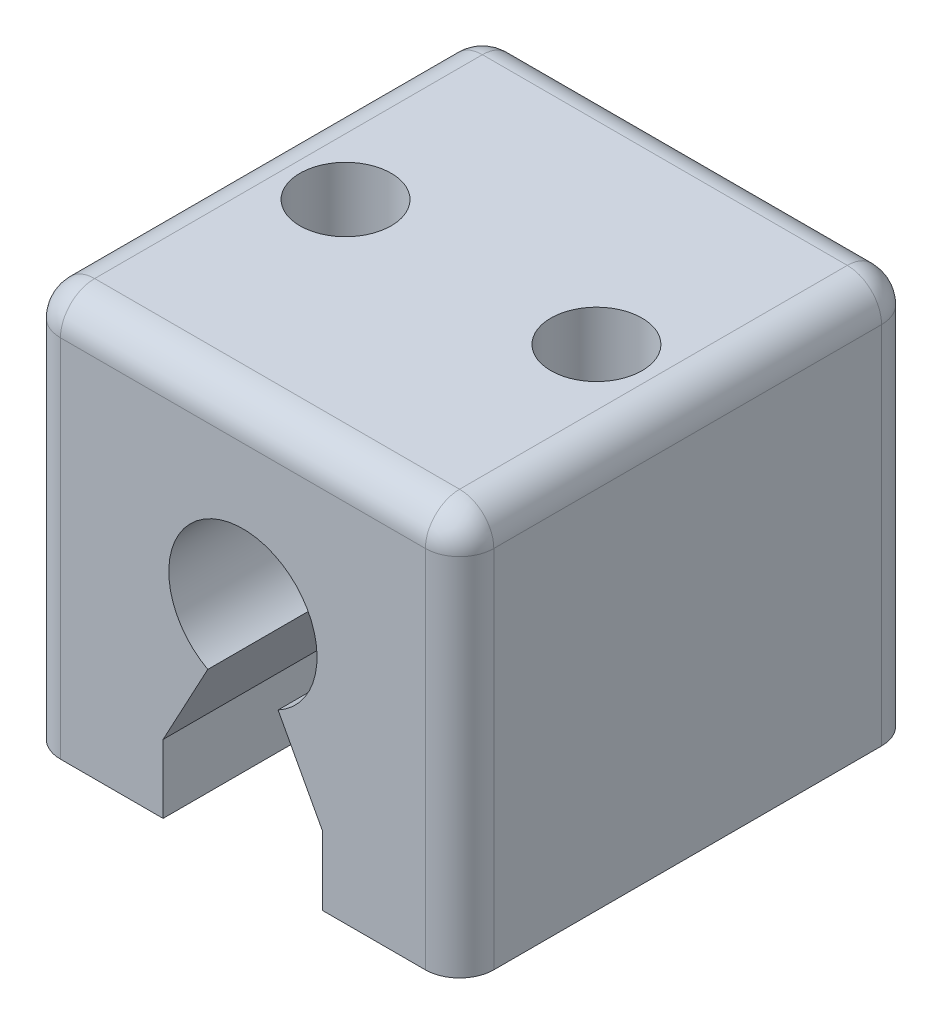
ISO-10303-21;
HEADER;
FILE_DESCRIPTION(('STEP AP214'),'2;1');
FILE_NAME('part.step','',(''),(''),'','','');
FILE_SCHEMA(('AUTOMOTIVE_DESIGN { 1 0 10303 214 1 1 1 1 }'));
ENDSEC;
DATA;
#1=APPLICATION_CONTEXT('core data for automotive mechanical design processes');
#2=APPLICATION_PROTOCOL_DEFINITION('international standard','automotive_design',2000,#1);
#3=PRODUCT_CONTEXT('',#1,'mechanical');
#4=PRODUCT('Part','Part','',(#3));
#5=PRODUCT_RELATED_PRODUCT_CATEGORY('part','',(#4));
#6=PRODUCT_DEFINITION_FORMATION('','',#4);
#7=PRODUCT_DEFINITION_CONTEXT('part definition',#1,'design');
#8=PRODUCT_DEFINITION('design','',#6,#7);
#9=PRODUCT_DEFINITION_SHAPE('','',#8);
#10=(LENGTH_UNIT() NAMED_UNIT(*) SI_UNIT(.MILLI.,.METRE.));
#11=(NAMED_UNIT(*) PLANE_ANGLE_UNIT() SI_UNIT($,.RADIAN.));
#12=(NAMED_UNIT(*) SI_UNIT($,.STERADIAN.) SOLID_ANGLE_UNIT());
#13=UNCERTAINTY_MEASURE_WITH_UNIT(LENGTH_MEASURE(1.E-05),#10,'distance_accuracy_value','');
#14=(GEOMETRIC_REPRESENTATION_CONTEXT(3) GLOBAL_UNCERTAINTY_ASSIGNED_CONTEXT((#13)) GLOBAL_UNIT_ASSIGNED_CONTEXT((#10,
#11,#12)) REPRESENTATION_CONTEXT('',''));
#15=CARTESIAN_POINT('',(0.,0.,0.));
#16=DIRECTION('',(0.,0.,1.));
#17=DIRECTION('',(1.,0.,0.));
#18=AXIS2_PLACEMENT_3D('',#15,#16,#17);
#19=CARTESIAN_POINT('',(10.2298014306717,26.9465131025721,20.));
#20=DIRECTION('',(0.,-1.,0.));
#21=DIRECTION('',(0.,0.,-1.));
#22=AXIS2_PLACEMENT_3D('',#19,#20,#21);
#23=CYLINDRICAL_SURFACE('',#22,2.1);
#24=CARTESIAN_POINT('',(10.2298014306717,-8.05348689742786,20.));
#25=DIRECTION('',(0.,-1.,0.));
#26=DIRECTION('',(0.,0.,-1.));
#27=AXIS2_PLACEMENT_3D('',#24,#25,#26);
#28=CIRCLE('',#27,2.1);
#29=CARTESIAN_POINT('',(10.2298014306717,-8.05348689742786,17.9));
#30=VERTEX_POINT('',#29);
#31=EDGE_CURVE('E244',#30,#30,#28,.T.);
#32=ORIENTED_EDGE('',*,*,#31,.T.);
#33=EDGE_LOOP('',(#32));
#34=FACE_BOUND('',#33,.T.);
#35=CARTESIAN_POINT('',(10.2298014306717,-1.05348689742786,20.));
#36=DIRECTION('',(0.,1.,0.));
#37=DIRECTION('',(0.,0.,1.));
#38=AXIS2_PLACEMENT_3D('',#35,#36,#37);
#39=CIRCLE('',#38,2.1);
#40=CARTESIAN_POINT('',(10.2298014306717,-1.05348689742786,22.1));
#41=VERTEX_POINT('',#40);
#42=EDGE_CURVE('E240',#41,#41,#39,.F.);
#43=ORIENTED_EDGE('',*,*,#42,.F.);
#44=EDGE_LOOP('',(#43));
#45=FACE_BOUND('',#44,.T.);
#46=ADVANCED_FACE('F39',(#34,#45),#23,.F.);
#47=CARTESIAN_POINT('',(-11.7701985693283,26.9465131025721,20.));
#48=DIRECTION('',(0.,-1.,0.));
#49=DIRECTION('',(0.,0.,-1.));
#50=AXIS2_PLACEMENT_3D('',#47,#48,#49);
#51=CYLINDRICAL_SURFACE('',#50,2.1);
#52=CARTESIAN_POINT('',(-11.7701985693283,-8.05348689742786,20.));
#53=DIRECTION('',(0.,-1.,0.));
#54=DIRECTION('',(0.,0.,-1.));
#55=AXIS2_PLACEMENT_3D('',#52,#53,#54);
#56=CIRCLE('',#55,2.1);
#57=CARTESIAN_POINT('',(-11.7701985693283,-8.05348689742786,17.9));
#58=VERTEX_POINT('',#57);
#59=EDGE_CURVE('E238',#58,#58,#56,.T.);
#60=ORIENTED_EDGE('',*,*,#59,.T.);
#61=EDGE_LOOP('',(#60));
#62=FACE_BOUND('',#61,.T.);
#63=CARTESIAN_POINT('',(-11.7701985693283,-1.05348689742786,20.));
#64=DIRECTION('',(0.,1.,0.));
#65=DIRECTION('',(0.,0.,1.));
#66=AXIS2_PLACEMENT_3D('',#63,#64,#65);
#67=CIRCLE('',#66,2.1);
#68=CARTESIAN_POINT('',(-11.7701985693283,-1.05348689742786,22.1));
#69=VERTEX_POINT('',#68);
#70=EDGE_CURVE('E234',#69,#69,#67,.F.);
#71=ORIENTED_EDGE('',*,*,#70,.F.);
#72=EDGE_LOOP('',(#71));
#73=FACE_BOUND('',#72,.T.);
#74=ADVANCED_FACE('F415',(#62,#73),#51,.F.);
#75=CARTESIAN_POINT('',(-0.770198569328279,10.9465131025721,40.));
#76=DIRECTION('',(0.,0.,1.));
#77=DIRECTION('',(1.,0.,0.));
#78=AXIS2_PLACEMENT_3D('',#75,#76,#77);
#79=PLANE('',#78);
#80=DIRECTION('',(1.,0.,0.));
#81=VECTOR('',#80,1.);
#82=CARTESIAN_POINT('',(-19.7701985693283,23.9465131025721,40.));
#83=LINE('',#82,#81);
#84=CARTESIAN_POINT('',(15.2298014306717,23.9465131025721,40.));
#85=VERTEX_POINT('',#84);
#86=CARTESIAN_POINT('',(-16.7701985693283,23.9465131025721,40.));
#87=VERTEX_POINT('',#86);
#88=EDGE_CURVE('E56',#85,#87,#83,.F.);
#89=ORIENTED_EDGE('',*,*,#88,.T.);
#90=DIRECTION('',(0.,-1.,0.));
#91=VECTOR('',#90,1.);
#92=CARTESIAN_POINT('',(-16.7701985693283,-8.05348689742786,40.));
#93=LINE('',#92,#91);
#94=CARTESIAN_POINT('',(-16.7701985693283,-8.05348689742786,40.));
#95=VERTEX_POINT('',#94);
#96=EDGE_CURVE('E11',#87,#95,#93,.T.);
#97=ORIENTED_EDGE('',*,*,#96,.T.);
#98=DIRECTION('',(1.,0.,0.));
#99=VECTOR('',#98,1.);
#100=CARTESIAN_POINT('',(-15.7701985693283,-8.05348689742786,40.));
#101=LINE('',#100,#99);
#102=CARTESIAN_POINT('',(-7.77019856932828,-8.05348689742786,40.));
#103=VERTEX_POINT('',#102);
#104=EDGE_CURVE('E151',#95,#103,#101,.T.);
#105=ORIENTED_EDGE('',*,*,#104,.T.);
#106=DIRECTION('',(0.,1.,0.));
#107=VECTOR('',#106,1.);
#108=CARTESIAN_POINT('',(-7.77019856932828,-8.05348689742786,40.));
#109=LINE('',#108,#107);
#110=CARTESIAN_POINT('',(-7.77019856932828,-2.05348689742786,40.));
#111=VERTEX_POINT('',#110);
#112=EDGE_CURVE('E156',#103,#111,#109,.T.);
#113=ORIENTED_EDGE('',*,*,#112,.T.);
#114=DIRECTION('',(0.474099823035017,0.880471099922175,0.));
#115=VECTOR('',#114,1.);
#116=CARTESIAN_POINT('',(-7.77019856932828,-2.05348689742786,40.));
#117=LINE('',#116,#115);
#118=CARTESIAN_POINT('',(-3.85184741905589,5.223450953078,40.));
#119=VERTEX_POINT('',#118);
#120=EDGE_CURVE('E178',#111,#119,#117,.T.);
#121=ORIENTED_EDGE('',*,*,#120,.T.);
#122=CARTESIAN_POINT('',(-0.770198569328279,10.9465131025721,40.));
#123=DIRECTION('',(0.,0.,1.));
#124=DIRECTION('',(1.,0.,0.));
#125=AXIS2_PLACEMENT_3D('',#122,#123,#124);
#126=CIRCLE('',#125,6.5);
#127=CARTESIAN_POINT('',(2.31145028039934,5.223450953078,40.));
#128=VERTEX_POINT('',#127);
#129=EDGE_CURVE('E181',#128,#119,#126,.T.);
#130=ORIENTED_EDGE('',*,*,#129,.F.);
#131=DIRECTION('',(-0.474099823035017,0.880471099922175,0.));
#132=VECTOR('',#131,1.);
#133=CARTESIAN_POINT('',(6.22980143067172,-2.05348689742786,40.));
#134=LINE('',#133,#132);
#135=CARTESIAN_POINT('',(6.22980143067172,-2.05348689742786,40.));
#136=VERTEX_POINT('',#135);
#137=EDGE_CURVE('E187',#136,#128,#134,.T.);
#138=ORIENTED_EDGE('',*,*,#137,.F.);
#139=DIRECTION('',(0.,1.,0.));
#140=VECTOR('',#139,1.);
#141=CARTESIAN_POINT('',(6.22980143067172,-8.05348689742786,40.));
#142=LINE('',#141,#140);
#143=CARTESIAN_POINT('',(6.22980143067172,-8.05348689742786,40.));
#144=VERTEX_POINT('',#143);
#145=EDGE_CURVE('E173',#144,#136,#142,.T.);
#146=ORIENTED_EDGE('',*,*,#145,.F.);
#147=DIRECTION('',(1.,0.,0.));
#148=VECTOR('',#147,1.);
#149=CARTESIAN_POINT('',(6.22980143067172,-8.05348689742786,40.));
#150=LINE('',#149,#148);
#151=CARTESIAN_POINT('',(15.2298014306717,-8.05348689742786,40.));
#152=VERTEX_POINT('',#151);
#153=EDGE_CURVE('E160',#144,#152,#150,.T.);
#154=ORIENTED_EDGE('',*,*,#153,.T.);
#155=DIRECTION('',(0.,1.,0.));
#156=VECTOR('',#155,1.);
#157=CARTESIAN_POINT('',(15.2298014306717,26.9465131025721,40.));
#158=LINE('',#157,#156);
#159=EDGE_CURVE('E49',#152,#85,#158,.T.);
#160=ORIENTED_EDGE('',*,*,#159,.T.);
#161=EDGE_LOOP('',(#89,#97,#105,#113,#121,#130,#138,#146,#154,#160));
#162=FACE_BOUND('',#161,.T.);
#163=ADVANCED_FACE('F153',(#162),#79,.T.);
#164=CARTESIAN_POINT('',(-0.770198569328279,10.9465131025721,0.));
#165=DIRECTION('',(0.,0.,1.));
#166=DIRECTION('',(1.,0.,0.));
#167=AXIS2_PLACEMENT_3D('',#164,#165,#166);
#168=PLANE('',#167);
#169=DIRECTION('',(1.,0.,0.));
#170=VECTOR('',#169,1.);
#171=CARTESIAN_POINT('',(-0.770198569328279,23.9465131025721,0.));
#172=LINE('',#171,#170);
#173=CARTESIAN_POINT('',(-16.7701985693283,23.9465131025721,0.));
#174=VERTEX_POINT('',#173);
#175=CARTESIAN_POINT('',(15.2298014306717,23.9465131025721,0.));
#176=VERTEX_POINT('',#175);
#177=EDGE_CURVE('E248',#174,#176,#172,.T.);
#178=ORIENTED_EDGE('',*,*,#177,.T.);
#179=DIRECTION('',(0.,1.,0.));
#180=VECTOR('',#179,1.);
#181=CARTESIAN_POINT('',(15.2298014306717,10.9465131025721,0.));
#182=LINE('',#181,#180);
#183=CARTESIAN_POINT('',(15.2298014306717,-8.05348689742786,0.));
#184=VERTEX_POINT('',#183);
#185=EDGE_CURVE('E252',#176,#184,#182,.F.);
#186=ORIENTED_EDGE('',*,*,#185,.T.);
#187=DIRECTION('',(1.,0.,0.));
#188=VECTOR('',#187,1.);
#189=CARTESIAN_POINT('',(6.22980143067172,-8.05348689742786,0.));
#190=LINE('',#189,#188);
#191=CARTESIAN_POINT('',(6.22980143067172,-8.05348689742786,0.));
#192=VERTEX_POINT('',#191);
#193=EDGE_CURVE('E192',#192,#184,#190,.T.);
#194=ORIENTED_EDGE('',*,*,#193,.F.);
#195=DIRECTION('',(0.,1.,0.));
#196=VECTOR('',#195,1.);
#197=CARTESIAN_POINT('',(6.22980143067172,-8.05348689742786,0.));
#198=LINE('',#197,#196);
#199=CARTESIAN_POINT('',(6.22980143067172,-2.05348689742786,0.));
#200=VERTEX_POINT('',#199);
#201=EDGE_CURVE('E214',#192,#200,#198,.T.);
#202=ORIENTED_EDGE('',*,*,#201,.T.);
#203=DIRECTION('',(-0.474099823035017,0.880471099922175,0.));
#204=VECTOR('',#203,1.);
#205=CARTESIAN_POINT('',(6.22980143067172,-2.05348689742786,0.));
#206=LINE('',#205,#204);
#207=CARTESIAN_POINT('',(2.31145028039934,5.223450953078,0.));
#208=VERTEX_POINT('',#207);
#209=EDGE_CURVE('E210',#200,#208,#206,.T.);
#210=ORIENTED_EDGE('',*,*,#209,.T.);
#211=CARTESIAN_POINT('',(-0.770198569328279,10.9465131025721,0.));
#212=DIRECTION('',(0.,0.,1.));
#213=DIRECTION('',(1.,0.,0.));
#214=AXIS2_PLACEMENT_3D('',#211,#212,#213);
#215=CIRCLE('',#214,6.5);
#216=CARTESIAN_POINT('',(-3.85184741905589,5.223450953078,0.));
#217=VERTEX_POINT('',#216);
#218=EDGE_CURVE('E206',#208,#217,#215,.T.);
#219=ORIENTED_EDGE('',*,*,#218,.T.);
#220=DIRECTION('',(0.474099823035017,0.880471099922175,0.));
#221=VECTOR('',#220,1.);
#222=CARTESIAN_POINT('',(-7.77019856932828,-2.05348689742786,0.));
#223=LINE('',#222,#221);
#224=CARTESIAN_POINT('',(-7.77019856932828,-2.05348689742786,0.));
#225=VERTEX_POINT('',#224);
#226=EDGE_CURVE('E202',#225,#217,#223,.T.);
#227=ORIENTED_EDGE('',*,*,#226,.F.);
#228=DIRECTION('',(0.,1.,0.));
#229=VECTOR('',#228,1.);
#230=CARTESIAN_POINT('',(-7.77019856932828,-8.05348689742786,0.));
#231=LINE('',#230,#229);
#232=CARTESIAN_POINT('',(-7.77019856932828,-8.05348689742786,0.));
#233=VERTEX_POINT('',#232);
#234=EDGE_CURVE('E199',#233,#225,#231,.T.);
#235=ORIENTED_EDGE('',*,*,#234,.F.);
#236=DIRECTION('',(1.,0.,0.));
#237=VECTOR('',#236,1.);
#238=CARTESIAN_POINT('',(-15.7701985693283,-8.05348689742786,0.));
#239=LINE('',#238,#237);
#240=CARTESIAN_POINT('',(-16.7701985693283,-8.05348689742786,0.));
#241=VERTEX_POINT('',#240);
#242=EDGE_CURVE('E167',#241,#233,#239,.T.);
#243=ORIENTED_EDGE('',*,*,#242,.F.);
#244=DIRECTION('',(0.,-1.,0.));
#245=VECTOR('',#244,1.);
#246=CARTESIAN_POINT('',(-16.7701985693283,10.9465131025721,0.));
#247=LINE('',#246,#245);
#248=EDGE_CURVE('E221',#241,#174,#247,.F.);
#249=ORIENTED_EDGE('',*,*,#248,.T.);
#250=EDGE_LOOP('',(#178,#186,#194,#202,#210,#219,#227,#235,#243,#249));
#251=FACE_BOUND('',#250,.T.);
#252=ADVANCED_FACE('F467',(#251),#168,.F.);
#253=CARTESIAN_POINT('',(-19.7701985693283,-8.05348689742786,40.));
#254=DIRECTION('',(1.,0.,0.));
#255=DIRECTION('',(0.,0.,-1.));
#256=AXIS2_PLACEMENT_3D('',#253,#254,#255);
#257=PLANE('',#256);
#258=DIRECTION('',(0.,0.,1.));
#259=VECTOR('',#258,1.);
#260=CARTESIAN_POINT('',(-19.7701985693283,23.9465131025721,40.));
#261=LINE('',#260,#259);
#262=CARTESIAN_POINT('',(-19.7701985693283,23.9465131025721,37.));
#263=VERTEX_POINT('',#262);
#264=CARTESIAN_POINT('',(-19.7701985693283,23.9465131025721,3.));
#265=VERTEX_POINT('',#264);
#266=EDGE_CURVE('E286',#263,#265,#261,.F.);
#267=ORIENTED_EDGE('',*,*,#266,.T.);
#268=DIRECTION('',(0.,-1.,0.));
#269=VECTOR('',#268,1.);
#270=CARTESIAN_POINT('',(-19.7701985693283,-8.05348689742786,3.));
#271=LINE('',#270,#269);
#272=CARTESIAN_POINT('',(-19.7701985693283,-8.05348689742786,3.));
#273=VERTEX_POINT('',#272);
#274=EDGE_CURVE('E289',#265,#273,#271,.T.);
#275=ORIENTED_EDGE('',*,*,#274,.T.);
#276=DIRECTION('',(0.,0.,1.));
#277=VECTOR('',#276,1.);
#278=CARTESIAN_POINT('',(-19.7701985693283,-8.05348689742786,0.));
#279=LINE('',#278,#277);
#280=CARTESIAN_POINT('',(-19.7701985693283,-8.05348689742786,37.));
#281=VERTEX_POINT('',#280);
#282=EDGE_CURVE('E196',#273,#281,#279,.T.);
#283=ORIENTED_EDGE('',*,*,#282,.T.);
#284=DIRECTION('',(0.,-1.,0.));
#285=VECTOR('',#284,1.);
#286=CARTESIAN_POINT('',(-19.7701985693283,26.9465131025721,37.));
#287=LINE('',#286,#285);
#288=EDGE_CURVE('E283',#281,#263,#287,.F.);
#289=ORIENTED_EDGE('',*,*,#288,.T.);
#290=EDGE_LOOP('',(#267,#275,#283,#289));
#291=FACE_BOUND('',#290,.T.);
#292=ADVANCED_FACE('F470',(#291),#257,.F.);
#293=CARTESIAN_POINT('',(18.2298014306717,-12.0534868974279,40.));
#294=DIRECTION('',(-1.,0.,0.));
#295=DIRECTION('',(0.,0.,1.));
#296=AXIS2_PLACEMENT_3D('',#293,#294,#295);
#297=PLANE('',#296);
#298=DIRECTION('',(0.,0.,1.));
#299=VECTOR('',#298,1.);
#300=CARTESIAN_POINT('',(18.2298014306717,-8.05348689742786,0.));
#301=LINE('',#300,#299);
#302=CARTESIAN_POINT('',(18.2298014306717,-8.05348689742786,3.));
#303=VERTEX_POINT('',#302);
#304=CARTESIAN_POINT('',(18.2298014306717,-8.05348689742786,37.));
#305=VERTEX_POINT('',#304);
#306=EDGE_CURVE('E371',#303,#305,#301,.T.);
#307=ORIENTED_EDGE('',*,*,#306,.F.);
#308=DIRECTION('',(0.,1.,0.));
#309=VECTOR('',#308,1.);
#310=CARTESIAN_POINT('',(18.2298014306717,-12.0534868974279,3.));
#311=LINE('',#310,#309);
#312=CARTESIAN_POINT('',(18.2298014306717,23.9465131025721,3.));
#313=VERTEX_POINT('',#312);
#314=EDGE_CURVE('E274',#303,#313,#311,.T.);
#315=ORIENTED_EDGE('',*,*,#314,.T.);
#316=DIRECTION('',(0.,0.,1.));
#317=VECTOR('',#316,1.);
#318=CARTESIAN_POINT('',(18.2298014306717,23.9465131025721,40.));
#319=LINE('',#318,#317);
#320=CARTESIAN_POINT('',(18.2298014306717,23.9465131025721,37.));
#321=VERTEX_POINT('',#320);
#322=EDGE_CURVE('E268',#313,#321,#319,.T.);
#323=ORIENTED_EDGE('',*,*,#322,.T.);
#324=DIRECTION('',(0.,1.,0.));
#325=VECTOR('',#324,1.);
#326=CARTESIAN_POINT('',(18.2298014306717,-8.05348689742786,37.));
#327=LINE('',#326,#325);
#328=EDGE_CURVE('E271',#321,#305,#327,.F.);
#329=ORIENTED_EDGE('',*,*,#328,.T.);
#330=EDGE_LOOP('',(#307,#315,#323,#329));
#331=FACE_BOUND('',#330,.T.);
#332=ADVANCED_FACE('F463',(#331),#297,.F.);
#333=CARTESIAN_POINT('',(6.22980143067172,-8.05348689742786,40.));
#334=DIRECTION('',(0.,1.,0.));
#335=DIRECTION('',(0.,0.,1.));
#336=AXIS2_PLACEMENT_3D('',#333,#334,#335);
#337=PLANE('',#336);
#338=ORIENTED_EDGE('',*,*,#31,.F.);
#339=EDGE_LOOP('',(#338));
#340=FACE_BOUND('',#339,.T.);
#341=ORIENTED_EDGE('',*,*,#193,.T.);
#342=CARTESIAN_POINT('',(15.2298014306717,-8.05348689742786,3.));
#343=DIRECTION('',(0.,1.,0.));
#344=DIRECTION('',(0.,0.,1.));
#345=AXIS2_PLACEMENT_3D('',#342,#343,#344);
#346=CIRCLE('',#345,3.);
#347=EDGE_CURVE('E280',#184,#303,#346,.F.);
#348=ORIENTED_EDGE('',*,*,#347,.T.);
#349=ORIENTED_EDGE('',*,*,#306,.T.);
#350=CARTESIAN_POINT('',(15.2298014306717,-8.05348689742786,37.));
#351=DIRECTION('',(0.,1.,0.));
#352=DIRECTION('',(0.,0.,1.));
#353=AXIS2_PLACEMENT_3D('',#350,#351,#352);
#354=CIRCLE('',#353,3.);
#355=EDGE_CURVE('E277',#305,#152,#354,.F.);
#356=ORIENTED_EDGE('',*,*,#355,.T.);
#357=ORIENTED_EDGE('',*,*,#153,.F.);
#358=DIRECTION('',(0.,0.,-1.));
#359=VECTOR('',#358,1.);
#360=CARTESIAN_POINT('',(6.22980143067172,-8.05348689742786,40.));
#361=LINE('',#360,#359);
#362=EDGE_CURVE('E218',#144,#192,#361,.T.);
#363=ORIENTED_EDGE('',*,*,#362,.T.);
#364=EDGE_LOOP('',(#341,#348,#349,#356,#357,#363));
#365=FACE_BOUND('',#364,.T.);
#366=ADVANCED_FACE('F443',(#340,#365),#337,.F.);
#367=CARTESIAN_POINT('',(6.22980143067172,-8.05348689742786,40.));
#368=DIRECTION('',(-1.,0.,0.));
#369=DIRECTION('',(0.,0.,1.));
#370=AXIS2_PLACEMENT_3D('',#367,#368,#369);
#371=PLANE('',#370);
#372=ORIENTED_EDGE('',*,*,#201,.F.);
#373=ORIENTED_EDGE('',*,*,#362,.F.);
#374=ORIENTED_EDGE('',*,*,#145,.T.);
#375=DIRECTION('',(0.,0.,-1.));
#376=VECTOR('',#375,1.);
#377=CARTESIAN_POINT('',(6.22980143067172,-2.05348689742786,40.));
#378=LINE('',#377,#376);
#379=EDGE_CURVE('E222',#136,#200,#378,.T.);
#380=ORIENTED_EDGE('',*,*,#379,.T.);
#381=EDGE_LOOP('',(#372,#373,#374,#380));
#382=FACE_BOUND('',#381,.T.);
#383=ADVANCED_FACE('F439',(#382),#371,.T.);
#384=CARTESIAN_POINT('',(6.22980143067172,-2.05348689742786,40.));
#385=DIRECTION('',(-0.880471099922175,-0.474099823035017,0.));
#386=DIRECTION('',(0.474099823035017,-0.880471099922175,0.));
#387=AXIS2_PLACEMENT_3D('',#384,#385,#386);
#388=PLANE('',#387);
#389=ORIENTED_EDGE('',*,*,#209,.F.);
#390=ORIENTED_EDGE('',*,*,#379,.F.);
#391=ORIENTED_EDGE('',*,*,#137,.T.);
#392=DIRECTION('',(0.,0.,-1.));
#393=VECTOR('',#392,1.);
#394=CARTESIAN_POINT('',(2.31145028039934,5.223450953078,40.));
#395=LINE('',#394,#393);
#396=EDGE_CURVE('E226',#128,#208,#395,.T.);
#397=ORIENTED_EDGE('',*,*,#396,.T.);
#398=EDGE_LOOP('',(#389,#390,#391,#397));
#399=FACE_BOUND('',#398,.T.);
#400=ADVANCED_FACE('F442',(#399),#388,.T.);
#401=CARTESIAN_POINT('',(-0.770198569328279,10.9465131025721,40.));
#402=DIRECTION('',(0.,0.,-1.));
#403=DIRECTION('',(-1.,0.,0.));
#404=AXIS2_PLACEMENT_3D('',#401,#402,#403);
#405=CYLINDRICAL_SURFACE('',#404,6.5);
#406=ORIENTED_EDGE('',*,*,#218,.F.);
#407=ORIENTED_EDGE('',*,*,#396,.F.);
#408=ORIENTED_EDGE('',*,*,#129,.T.);
#409=DIRECTION('',(0.,0.,-1.));
#410=VECTOR('',#409,1.);
#411=CARTESIAN_POINT('',(-3.85184741905589,5.223450953078,40.));
#412=LINE('',#411,#410);
#413=EDGE_CURVE('E229',#119,#217,#412,.T.);
#414=ORIENTED_EDGE('',*,*,#413,.T.);
#415=EDGE_LOOP('',(#406,#407,#408,#414));
#416=FACE_BOUND('',#415,.T.);
#417=ADVANCED_FACE('F447',(#416),#405,.F.);
#418=CARTESIAN_POINT('',(-7.77019856932828,-2.05348689742786,40.));
#419=DIRECTION('',(-0.880471099922175,0.474099823035017,0.));
#420=DIRECTION('',(-0.474099823035017,-0.880471099922175,0.));
#421=AXIS2_PLACEMENT_3D('',#418,#419,#420);
#422=PLANE('',#421);
#423=ORIENTED_EDGE('',*,*,#226,.T.);
#424=ORIENTED_EDGE('',*,*,#413,.F.);
#425=ORIENTED_EDGE('',*,*,#120,.F.);
#426=DIRECTION('',(0.,0.,-1.));
#427=VECTOR('',#426,1.);
#428=CARTESIAN_POINT('',(-7.77019856932828,-2.05348689742786,40.));
#429=LINE('',#428,#427);
#430=EDGE_CURVE('E172',#111,#225,#429,.T.);
#431=ORIENTED_EDGE('',*,*,#430,.T.);
#432=EDGE_LOOP('',(#423,#424,#425,#431));
#433=FACE_BOUND('',#432,.T.);
#434=ADVANCED_FACE('F451',(#433),#422,.F.);
#435=CARTESIAN_POINT('',(-7.77019856932828,-8.05348689742786,40.));
#436=DIRECTION('',(-1.,0.,0.));
#437=DIRECTION('',(0.,0.,1.));
#438=AXIS2_PLACEMENT_3D('',#435,#436,#437);
#439=PLANE('',#438);
#440=ORIENTED_EDGE('',*,*,#234,.T.);
#441=ORIENTED_EDGE('',*,*,#430,.F.);
#442=ORIENTED_EDGE('',*,*,#112,.F.);
#443=DIRECTION('',(0.,0.,-1.));
#444=VECTOR('',#443,1.);
#445=CARTESIAN_POINT('',(-7.77019856932828,-8.05348689742786,40.));
#446=LINE('',#445,#444);
#447=EDGE_CURVE('E163',#103,#233,#446,.T.);
#448=ORIENTED_EDGE('',*,*,#447,.T.);
#449=EDGE_LOOP('',(#440,#441,#442,#448));
#450=FACE_BOUND('',#449,.T.);
#451=ADVANCED_FACE('F175',(#450),#439,.F.);
#452=CARTESIAN_POINT('',(-15.7701985693283,-8.05348689742786,40.));
#453=DIRECTION('',(0.,1.,0.));
#454=DIRECTION('',(0.,0.,1.));
#455=AXIS2_PLACEMENT_3D('',#452,#453,#454);
#456=PLANE('',#455);
#457=ORIENTED_EDGE('',*,*,#59,.F.);
#458=EDGE_LOOP('',(#457));
#459=FACE_BOUND('',#458,.T.);
#460=ORIENTED_EDGE('',*,*,#282,.F.);
#461=CARTESIAN_POINT('',(-16.7701985693283,-8.05348689742786,3.));
#462=DIRECTION('',(0.,1.,0.));
#463=DIRECTION('',(0.,0.,1.));
#464=AXIS2_PLACEMENT_3D('',#461,#462,#463);
#465=CIRCLE('',#464,3.);
#466=EDGE_CURVE('E295',#273,#241,#465,.F.);
#467=ORIENTED_EDGE('',*,*,#466,.T.);
#468=ORIENTED_EDGE('',*,*,#242,.T.);
#469=ORIENTED_EDGE('',*,*,#447,.F.);
#470=ORIENTED_EDGE('',*,*,#104,.F.);
#471=CARTESIAN_POINT('',(-16.7701985693283,-8.05348689742786,37.));
#472=DIRECTION('',(0.,1.,0.));
#473=DIRECTION('',(0.,0.,1.));
#474=AXIS2_PLACEMENT_3D('',#471,#472,#473);
#475=CIRCLE('',#474,3.);
#476=EDGE_CURVE('E292',#95,#281,#475,.F.);
#477=ORIENTED_EDGE('',*,*,#476,.T.);
#478=EDGE_LOOP('',(#460,#467,#468,#469,#470,#477));
#479=FACE_BOUND('',#478,.T.);
#480=ADVANCED_FACE('F165',(#459,#479),#456,.F.);
#481=CARTESIAN_POINT('',(-19.7701985693283,26.9465131025721,0.));
#482=DIRECTION('',(0.,-1.,0.));
#483=DIRECTION('',(0.,0.,-1.));
#484=AXIS2_PLACEMENT_3D('',#481,#482,#483);
#485=PLANE('',#484);
#486=DIRECTION('',(0.,0.,1.));
#487=VECTOR('',#486,1.);
#488=CARTESIAN_POINT('',(15.2298014306717,26.9465131025721,0.));
#489=LINE('',#488,#487);
#490=CARTESIAN_POINT('',(15.2298014306717,26.9465131025721,37.));
#491=VERTEX_POINT('',#490);
#492=CARTESIAN_POINT('',(15.2298014306717,26.9465131025721,3.));
#493=VERTEX_POINT('',#492);
#494=EDGE_CURVE('E255',#491,#493,#489,.F.);
#495=ORIENTED_EDGE('',*,*,#494,.T.);
#496=DIRECTION('',(1.,0.,0.));
#497=VECTOR('',#496,1.);
#498=CARTESIAN_POINT('',(-19.7701985693283,26.9465131025721,3.));
#499=LINE('',#498,#497);
#500=CARTESIAN_POINT('',(-16.7701985693283,26.9465131025721,3.));
#501=VERTEX_POINT('',#500);
#502=EDGE_CURVE('E264',#493,#501,#499,.F.);
#503=ORIENTED_EDGE('',*,*,#502,.T.);
#504=DIRECTION('',(0.,0.,1.));
#505=VECTOR('',#504,1.);
#506=CARTESIAN_POINT('',(-16.7701985693283,26.9465131025721,0.));
#507=LINE('',#506,#505);
#508=CARTESIAN_POINT('',(-16.7701985693283,26.9465131025721,37.));
#509=VERTEX_POINT('',#508);
#510=EDGE_CURVE('E261',#501,#509,#507,.T.);
#511=ORIENTED_EDGE('',*,*,#510,.T.);
#512=DIRECTION('',(1.,0.,0.));
#513=VECTOR('',#512,1.);
#514=CARTESIAN_POINT('',(18.2298014306717,26.9465131025721,37.));
#515=LINE('',#514,#513);
#516=EDGE_CURVE('E258',#509,#491,#515,.T.);
#517=ORIENTED_EDGE('',*,*,#516,.T.);
#518=EDGE_LOOP('',(#495,#503,#511,#517));
#519=FACE_BOUND('',#518,.T.);
#520=CARTESIAN_POINT('',(10.2298014306717,26.9465131025721,20.));
#521=DIRECTION('',(0.,1.,0.));
#522=DIRECTION('',(0.,0.,1.));
#523=AXIS2_PLACEMENT_3D('',#520,#521,#522);
#524=CIRCLE('',#523,4.);
#525=CARTESIAN_POINT('',(10.2298014306717,26.9465131025721,24.));
#526=VERTEX_POINT('',#525);
#527=EDGE_CURVE('E347',#526,#526,#524,.T.);
#528=ORIENTED_EDGE('',*,*,#527,.F.);
#529=EDGE_LOOP('',(#528));
#530=FACE_BOUND('',#529,.T.);
#531=CARTESIAN_POINT('',(-11.7701985693283,26.9465131025721,20.));
#532=DIRECTION('',(0.,1.,0.));
#533=DIRECTION('',(0.,0.,1.));
#534=AXIS2_PLACEMENT_3D('',#531,#532,#533);
#535=CIRCLE('',#534,4.);
#536=CARTESIAN_POINT('',(-11.7701985693283,26.9465131025721,24.));
#537=VERTEX_POINT('',#536);
#538=EDGE_CURVE('E361',#537,#537,#535,.T.);
#539=ORIENTED_EDGE('',*,*,#538,.F.);
#540=EDGE_LOOP('',(#539));
#541=FACE_BOUND('',#540,.T.);
#542=ADVANCED_FACE('F396',(#519,#530,#541),#485,.F.);
#543=CARTESIAN_POINT('',(-11.7701985693283,-1.05348689742786,20.));
#544=DIRECTION('',(0.,1.,0.));
#545=DIRECTION('',(0.,0.,1.));
#546=AXIS2_PLACEMENT_3D('',#543,#544,#545);
#547=PLANE('',#546);
#548=CARTESIAN_POINT('',(-11.7701985693283,-1.05348689742786,20.));
#549=DIRECTION('',(0.,1.,0.));
#550=DIRECTION('',(0.,0.,1.));
#551=AXIS2_PLACEMENT_3D('',#548,#549,#550);
#552=CIRCLE('',#551,4.);
#553=CARTESIAN_POINT('',(-11.7701985693283,-1.05348689742786,24.));
#554=VERTEX_POINT('',#553);
#555=EDGE_CURVE('E239',#554,#554,#552,.T.);
#556=ORIENTED_EDGE('',*,*,#555,.T.);
#557=EDGE_LOOP('',(#556));
#558=FACE_BOUND('',#557,.T.);
#559=ORIENTED_EDGE('',*,*,#70,.T.);
#560=EDGE_LOOP('',(#559));
#561=FACE_BOUND('',#560,.T.);
#562=ADVANCED_FACE('F428',(#558,#561),#547,.T.);
#563=CARTESIAN_POINT('',(-11.7701985693283,-1.05348689742786,20.));
#564=DIRECTION('',(0.,1.,0.));
#565=DIRECTION('',(0.,0.,1.));
#566=AXIS2_PLACEMENT_3D('',#563,#564,#565);
#567=CYLINDRICAL_SURFACE('',#566,4.);
#568=ORIENTED_EDGE('',*,*,#555,.F.);
#569=EDGE_LOOP('',(#568));
#570=FACE_BOUND('',#569,.T.);
#571=ORIENTED_EDGE('',*,*,#538,.T.);
#572=EDGE_LOOP('',(#571));
#573=FACE_BOUND('',#572,.T.);
#574=ADVANCED_FACE('F431',(#570,#573),#567,.F.);
#575=CARTESIAN_POINT('',(10.2298014306717,-1.05348689742786,20.));
#576=DIRECTION('',(0.,1.,0.));
#577=DIRECTION('',(0.,0.,1.));
#578=AXIS2_PLACEMENT_3D('',#575,#576,#577);
#579=PLANE('',#578);
#580=CARTESIAN_POINT('',(10.2298014306717,-1.05348689742786,20.));
#581=DIRECTION('',(0.,1.,0.));
#582=DIRECTION('',(0.,0.,1.));
#583=AXIS2_PLACEMENT_3D('',#580,#581,#582);
#584=CIRCLE('',#583,4.);
#585=CARTESIAN_POINT('',(10.2298014306717,-1.05348689742786,24.));
#586=VERTEX_POINT('',#585);
#587=EDGE_CURVE('E245',#586,#586,#584,.T.);
#588=ORIENTED_EDGE('',*,*,#587,.T.);
#589=EDGE_LOOP('',(#588));
#590=FACE_BOUND('',#589,.T.);
#591=ORIENTED_EDGE('',*,*,#42,.T.);
#592=EDGE_LOOP('',(#591));
#593=FACE_BOUND('',#592,.T.);
#594=ADVANCED_FACE('F434',(#590,#593),#579,.T.);
#595=CARTESIAN_POINT('',(10.2298014306717,-1.05348689742786,20.));
#596=DIRECTION('',(0.,1.,0.));
#597=DIRECTION('',(0.,0.,1.));
#598=AXIS2_PLACEMENT_3D('',#595,#596,#597);
#599=CYLINDRICAL_SURFACE('',#598,4.);
#600=ORIENTED_EDGE('',*,*,#587,.F.);
#601=EDGE_LOOP('',(#600));
#602=FACE_BOUND('',#601,.T.);
#603=ORIENTED_EDGE('',*,*,#527,.T.);
#604=EDGE_LOOP('',(#603));
#605=FACE_BOUND('',#604,.T.);
#606=ADVANCED_FACE('F426',(#602,#605),#599,.F.);
#607=CARTESIAN_POINT('',(-16.7701985693283,10.9465131025721,37.));
#608=DIRECTION('',(0.,1.,0.));
#609=DIRECTION('',(0.,0.,1.));
#610=AXIS2_PLACEMENT_3D('',#607,#608,#609);
#611=CYLINDRICAL_SURFACE('',#610,3.);
#612=ORIENTED_EDGE('',*,*,#476,.F.);
#613=ORIENTED_EDGE('',*,*,#96,.F.);
#614=CARTESIAN_POINT('',(-16.7701985693283,23.9465131025721,37.));
#615=DIRECTION('',(0.,1.,0.));
#616=DIRECTION('',(0.,0.,1.));
#617=AXIS2_PLACEMENT_3D('',#614,#615,#616);
#618=CIRCLE('',#617,3.);
#619=EDGE_CURVE('E339',#263,#87,#618,.T.);
#620=ORIENTED_EDGE('',*,*,#619,.F.);
#621=ORIENTED_EDGE('',*,*,#288,.F.);
#622=EDGE_LOOP('',(#612,#613,#620,#621));
#623=FACE_BOUND('',#622,.T.);
#624=ADVANCED_FACE('F41',(#623),#611,.T.);
#625=CARTESIAN_POINT('',(15.2298014306717,10.9465131025721,37.));
#626=DIRECTION('',(0.,-1.,0.));
#627=DIRECTION('',(0.,0.,-1.));
#628=AXIS2_PLACEMENT_3D('',#625,#626,#627);
#629=CYLINDRICAL_SURFACE('',#628,3.);
#630=ORIENTED_EDGE('',*,*,#355,.F.);
#631=ORIENTED_EDGE('',*,*,#328,.F.);
#632=CARTESIAN_POINT('',(15.2298014306717,23.9465131025721,37.));
#633=DIRECTION('',(0.,1.,0.));
#634=DIRECTION('',(-1.,0.,0.));
#635=AXIS2_PLACEMENT_3D('',#632,#633,#634);
#636=CIRCLE('',#635,3.);
#637=EDGE_CURVE('E336',#85,#321,#636,.T.);
#638=ORIENTED_EDGE('',*,*,#637,.F.);
#639=ORIENTED_EDGE('',*,*,#159,.F.);
#640=EDGE_LOOP('',(#630,#631,#638,#639));
#641=FACE_BOUND('',#640,.T.);
#642=ADVANCED_FACE('F385',(#641),#629,.T.);
#643=CARTESIAN_POINT('',(-19.7701985693283,23.9465131025721,37.));
#644=DIRECTION('',(-1.,0.,0.));
#645=DIRECTION('',(0.,0.,1.));
#646=AXIS2_PLACEMENT_3D('',#643,#644,#645);
#647=CYLINDRICAL_SURFACE('',#646,3.);
#648=CARTESIAN_POINT('',(-16.7701985693283,23.9465131025721,37.));
#649=DIRECTION('',(-1.,0.,0.));
#650=DIRECTION('',(0.,0.,1.));
#651=AXIS2_PLACEMENT_3D('',#648,#649,#650);
#652=CIRCLE('',#651,3.);
#653=EDGE_CURVE('E43',#87,#509,#652,.T.);
#654=ORIENTED_EDGE('',*,*,#653,.F.);
#655=ORIENTED_EDGE('',*,*,#88,.F.);
#656=CARTESIAN_POINT('',(15.2298014306717,23.9465131025721,37.));
#657=DIRECTION('',(1.,0.,0.));
#658=DIRECTION('',(0.,0.,-1.));
#659=AXIS2_PLACEMENT_3D('',#656,#657,#658);
#660=CIRCLE('',#659,3.);
#661=EDGE_CURVE('E332',#491,#85,#660,.T.);
#662=ORIENTED_EDGE('',*,*,#661,.F.);
#663=ORIENTED_EDGE('',*,*,#516,.F.);
#664=EDGE_LOOP('',(#654,#655,#662,#663));
#665=FACE_BOUND('',#664,.T.);
#666=ADVANCED_FACE('F394',(#665),#647,.T.);
#667=CARTESIAN_POINT('',(-16.7701985693283,23.9465131025721,37.));
#668=DIRECTION('',(0.,0.,1.));
#669=DIRECTION('',(1.,0.,0.));
#670=AXIS2_PLACEMENT_3D('',#667,#668,#669);
#671=SPHERICAL_SURFACE('',#670,3.);
#672=ORIENTED_EDGE('',*,*,#619,.T.);
#673=ORIENTED_EDGE('',*,*,#653,.T.);
#674=CARTESIAN_POINT('',(-16.7701985693283,23.9465131025721,37.));
#675=DIRECTION('',(0.,0.,1.));
#676=DIRECTION('',(1.,0.,0.));
#677=AXIS2_PLACEMENT_3D('',#674,#675,#676);
#678=CIRCLE('',#677,3.);
#679=EDGE_CURVE('E328',#263,#509,#678,.F.);
#680=ORIENTED_EDGE('',*,*,#679,.F.);
#681=EDGE_LOOP('',(#672,#673,#680));
#682=FACE_BOUND('',#681,.T.);
#683=ADVANCED_FACE('F405',(#682),#671,.T.);
#684=CARTESIAN_POINT('',(15.2298014306717,23.9465131025721,37.));
#685=DIRECTION('',(0.,0.,1.));
#686=DIRECTION('',(1.,0.,0.));
#687=AXIS2_PLACEMENT_3D('',#684,#685,#686);
#688=SPHERICAL_SURFACE('',#687,3.);
#689=ORIENTED_EDGE('',*,*,#661,.T.);
#690=ORIENTED_EDGE('',*,*,#637,.T.);
#691=CARTESIAN_POINT('',(15.2298014306717,23.9465131025721,37.));
#692=DIRECTION('',(0.,0.,1.));
#693=DIRECTION('',(1.,0.,0.));
#694=AXIS2_PLACEMENT_3D('',#691,#692,#693);
#695=CIRCLE('',#694,3.);
#696=EDGE_CURVE('E324',#491,#321,#695,.F.);
#697=ORIENTED_EDGE('',*,*,#696,.F.);
#698=EDGE_LOOP('',(#689,#690,#697));
#699=FACE_BOUND('',#698,.T.);
#700=ADVANCED_FACE('F390',(#699),#688,.T.);
#701=CARTESIAN_POINT('',(-16.7701985693283,23.9465131025721,0.));
#702=DIRECTION('',(0.,0.,1.));
#703=DIRECTION('',(1.,0.,0.));
#704=AXIS2_PLACEMENT_3D('',#701,#702,#703);
#705=CYLINDRICAL_SURFACE('',#704,3.);
#706=ORIENTED_EDGE('',*,*,#679,.T.);
#707=ORIENTED_EDGE('',*,*,#510,.F.);
#708=CARTESIAN_POINT('',(-16.7701985693283,23.9465131025721,3.));
#709=DIRECTION('',(0.,0.,-1.));
#710=DIRECTION('',(0.,1.,0.));
#711=AXIS2_PLACEMENT_3D('',#708,#709,#710);
#712=CIRCLE('',#711,3.);
#713=EDGE_CURVE('E320',#265,#501,#712,.T.);
#714=ORIENTED_EDGE('',*,*,#713,.F.);
#715=ORIENTED_EDGE('',*,*,#266,.F.);
#716=EDGE_LOOP('',(#706,#707,#714,#715));
#717=FACE_BOUND('',#716,.T.);
#718=ADVANCED_FACE('F403',(#717),#705,.T.);
#719=CARTESIAN_POINT('',(-16.7701985693283,-8.05348689742786,3.));
#720=DIRECTION('',(0.,-1.,0.));
#721=DIRECTION('',(0.,0.,-1.));
#722=AXIS2_PLACEMENT_3D('',#719,#720,#721);
#723=CYLINDRICAL_SURFACE('',#722,3.);
#724=ORIENTED_EDGE('',*,*,#466,.F.);
#725=ORIENTED_EDGE('',*,*,#274,.F.);
#726=CARTESIAN_POINT('',(-16.7701985693283,23.9465131025721,3.));
#727=DIRECTION('',(0.,1.,0.));
#728=DIRECTION('',(0.,0.,1.));
#729=AXIS2_PLACEMENT_3D('',#726,#727,#728);
#730=CIRCLE('',#729,3.);
#731=EDGE_CURVE('E316',#174,#265,#730,.T.);
#732=ORIENTED_EDGE('',*,*,#731,.F.);
#733=ORIENTED_EDGE('',*,*,#248,.F.);
#734=EDGE_LOOP('',(#724,#725,#732,#733));
#735=FACE_BOUND('',#734,.T.);
#736=ADVANCED_FACE('F497',(#735),#723,.T.);
#737=CARTESIAN_POINT('',(15.2298014306717,-12.0534868974279,3.));
#738=DIRECTION('',(0.,1.,0.));
#739=DIRECTION('',(0.,0.,1.));
#740=AXIS2_PLACEMENT_3D('',#737,#738,#739);
#741=CYLINDRICAL_SURFACE('',#740,3.);
#742=ORIENTED_EDGE('',*,*,#347,.F.);
#743=ORIENTED_EDGE('',*,*,#185,.F.);
#744=CARTESIAN_POINT('',(15.2298014306717,23.9465131025721,3.));
#745=DIRECTION('',(0.,1.,0.));
#746=DIRECTION('',(0.,0.,1.));
#747=AXIS2_PLACEMENT_3D('',#744,#745,#746);
#748=CIRCLE('',#747,3.);
#749=EDGE_CURVE('E312',#313,#176,#748,.T.);
#750=ORIENTED_EDGE('',*,*,#749,.F.);
#751=ORIENTED_EDGE('',*,*,#314,.F.);
#752=EDGE_LOOP('',(#742,#743,#750,#751));
#753=FACE_BOUND('',#752,.T.);
#754=ADVANCED_FACE('F493',(#753),#741,.T.);
#755=CARTESIAN_POINT('',(15.2298014306717,23.9465131025721,40.));
#756=DIRECTION('',(0.,0.,1.));
#757=DIRECTION('',(1.,0.,0.));
#758=AXIS2_PLACEMENT_3D('',#755,#756,#757);
#759=CYLINDRICAL_SURFACE('',#758,3.);
#760=ORIENTED_EDGE('',*,*,#696,.T.);
#761=ORIENTED_EDGE('',*,*,#322,.F.);
#762=CARTESIAN_POINT('',(15.2298014306717,23.9465131025721,3.));
#763=DIRECTION('',(0.,0.,-1.));
#764=DIRECTION('',(-1.,0.,0.));
#765=AXIS2_PLACEMENT_3D('',#762,#763,#764);
#766=CIRCLE('',#765,3.);
#767=EDGE_CURVE('E308',#493,#313,#766,.T.);
#768=ORIENTED_EDGE('',*,*,#767,.F.);
#769=ORIENTED_EDGE('',*,*,#494,.F.);
#770=EDGE_LOOP('',(#760,#761,#768,#769));
#771=FACE_BOUND('',#770,.T.);
#772=ADVANCED_FACE('F489',(#771),#759,.T.);
#773=CARTESIAN_POINT('',(-16.7701985693283,23.9465131025721,3.));
#774=DIRECTION('',(-1.,0.,0.));
#775=DIRECTION('',(0.,0.,1.));
#776=AXIS2_PLACEMENT_3D('',#773,#774,#775);
#777=SPHERICAL_SURFACE('',#776,3.);
#778=ORIENTED_EDGE('',*,*,#731,.T.);
#779=ORIENTED_EDGE('',*,*,#713,.T.);
#780=CARTESIAN_POINT('',(-16.7701985693283,23.9465131025721,3.));
#781=DIRECTION('',(-1.,0.,0.));
#782=DIRECTION('',(0.,0.,1.));
#783=AXIS2_PLACEMENT_3D('',#780,#781,#782);
#784=CIRCLE('',#783,3.);
#785=EDGE_CURVE('E305',#174,#501,#784,.F.);
#786=ORIENTED_EDGE('',*,*,#785,.F.);
#787=EDGE_LOOP('',(#778,#779,#786));
#788=FACE_BOUND('',#787,.T.);
#789=ADVANCED_FACE('F485',(#788),#777,.T.);
#790=CARTESIAN_POINT('',(15.2298014306717,23.9465131025721,3.));
#791=DIRECTION('',(1.,0.,0.));
#792=DIRECTION('',(0.,1.,0.));
#793=AXIS2_PLACEMENT_3D('',#790,#791,#792);
#794=SPHERICAL_SURFACE('',#793,3.);
#795=ORIENTED_EDGE('',*,*,#767,.T.);
#796=ORIENTED_EDGE('',*,*,#749,.T.);
#797=CARTESIAN_POINT('',(15.2298014306717,23.9465131025721,3.));
#798=DIRECTION('',(1.,0.,0.));
#799=DIRECTION('',(0.,0.,-1.));
#800=AXIS2_PLACEMENT_3D('',#797,#798,#799);
#801=CIRCLE('',#800,3.);
#802=EDGE_CURVE('E302',#493,#176,#801,.F.);
#803=ORIENTED_EDGE('',*,*,#802,.F.);
#804=EDGE_LOOP('',(#795,#796,#803));
#805=FACE_BOUND('',#804,.T.);
#806=ADVANCED_FACE('F481',(#805),#794,.T.);
#807=CARTESIAN_POINT('',(-0.770198569328279,23.9465131025721,3.));
#808=DIRECTION('',(1.,0.,0.));
#809=DIRECTION('',(0.,0.,-1.));
#810=AXIS2_PLACEMENT_3D('',#807,#808,#809);
#811=CYLINDRICAL_SURFACE('',#810,3.);
#812=ORIENTED_EDGE('',*,*,#785,.T.);
#813=ORIENTED_EDGE('',*,*,#502,.F.);
#814=ORIENTED_EDGE('',*,*,#802,.T.);
#815=ORIENTED_EDGE('',*,*,#177,.F.);
#816=EDGE_LOOP('',(#812,#813,#814,#815));
#817=FACE_BOUND('',#816,.T.);
#818=ADVANCED_FACE('F478',(#817),#811,.T.);
#819=CLOSED_SHELL('',(#46,#74,#163,#252,#292,#332,#366,#383,#400,#417,#434,#451,#480,#542,#562,
#574,#594,#606,#624,#642,#666,#683,#700,#718,#736,#754,#772,#789,#806,#818));
#820=MANIFOLD_SOLID_BREP('B2',#819);
#821=ADVANCED_BREP_SHAPE_REPRESENTATION('',(#18,#820),#14);
#822=SHAPE_DEFINITION_REPRESENTATION(#9,#821);
ENDSEC;
END-ISO-10303-21;
